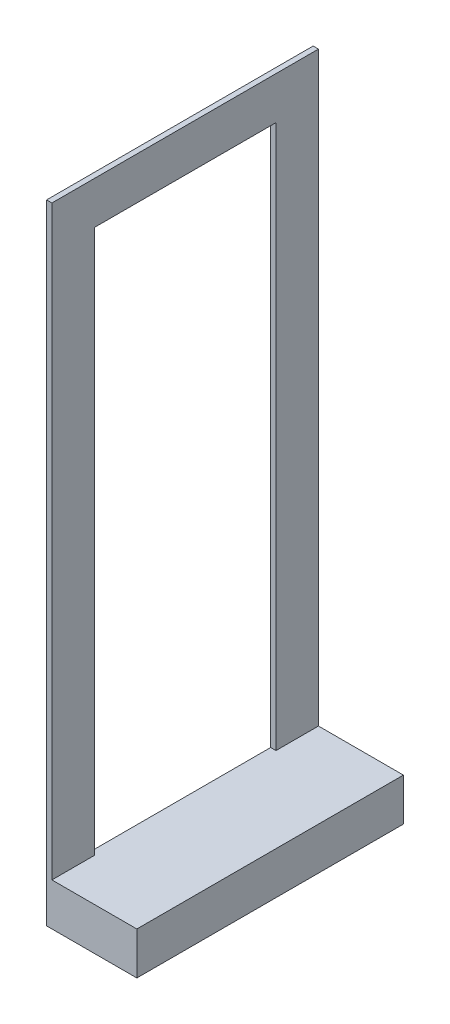
ISO-10303-21;
HEADER;
FILE_DESCRIPTION(('STEP AP214'),'2;1');
FILE_NAME('part.step','',(''),(''),'','','');
FILE_SCHEMA(('AUTOMOTIVE_DESIGN { 1 0 10303 214 1 1 1 1 }'));
ENDSEC;
DATA;
#1=APPLICATION_CONTEXT('core data for automotive mechanical design processes');
#2=APPLICATION_PROTOCOL_DEFINITION('international standard','automotive_design',2000,#1);
#3=PRODUCT_CONTEXT('',#1,'mechanical');
#4=PRODUCT('Part','Part','',(#3));
#5=PRODUCT_RELATED_PRODUCT_CATEGORY('part','',(#4));
#6=PRODUCT_DEFINITION_FORMATION('','',#4);
#7=PRODUCT_DEFINITION_CONTEXT('part definition',#1,'design');
#8=PRODUCT_DEFINITION('design','',#6,#7);
#9=PRODUCT_DEFINITION_SHAPE('','',#8);
#10=(LENGTH_UNIT() NAMED_UNIT(*) SI_UNIT(.MILLI.,.METRE.));
#11=(NAMED_UNIT(*) PLANE_ANGLE_UNIT() SI_UNIT($,.RADIAN.));
#12=(NAMED_UNIT(*) SI_UNIT($,.STERADIAN.) SOLID_ANGLE_UNIT());
#13=UNCERTAINTY_MEASURE_WITH_UNIT(LENGTH_MEASURE(1.E-05),#10,'distance_accuracy_value','');
#14=(GEOMETRIC_REPRESENTATION_CONTEXT(3) GLOBAL_UNCERTAINTY_ASSIGNED_CONTEXT((#13)) GLOBAL_UNIT_ASSIGNED_CONTEXT((#10,
#11,#12)) REPRESENTATION_CONTEXT('',''));
#15=CARTESIAN_POINT('',(0.,0.,0.));
#16=DIRECTION('',(0.,0.,1.));
#17=DIRECTION('',(1.,0.,0.));
#18=AXIS2_PLACEMENT_3D('',#15,#16,#17);
#19=CARTESIAN_POINT('',(180.9115,0.,0.));
#20=DIRECTION('',(1.,0.,0.));
#21=DIRECTION('',(0.,0.,-1.));
#22=AXIS2_PLACEMENT_3D('',#19,#20,#21);
#23=PLANE('',#22);
#24=DIRECTION('',(0.,0.,1.));
#25=VECTOR('',#24,1.);
#26=CARTESIAN_POINT('',(180.9115,12.7,0.));
#27=LINE('',#26,#25);
#28=CARTESIAN_POINT('',(180.9115,12.7,-79.7131009293537));
#29=VERTEX_POINT('',#28);
#30=CARTESIAN_POINT('',(180.9115,12.7,-67.0131009293537));
#31=VERTEX_POINT('',#30);
#32=EDGE_CURVE('E93',#29,#31,#27,.T.);
#33=ORIENTED_EDGE('',*,*,#32,.F.);
#34=DIRECTION('',(0.,1.,0.));
#35=VECTOR('',#34,1.);
#36=CARTESIAN_POINT('',(180.9115,0.,-79.7131009293537));
#37=LINE('',#36,#35);
#38=CARTESIAN_POINT('',(180.9115,188.030607332465,-79.7131009293537));
#39=VERTEX_POINT('',#38);
#40=EDGE_CURVE('E223',#29,#39,#37,.T.);
#41=ORIENTED_EDGE('',*,*,#40,.T.);
#42=DIRECTION('',(0.,0.,1.));
#43=VECTOR('',#42,1.);
#44=CARTESIAN_POINT('',(180.9115,188.030607332465,0.));
#45=LINE('',#44,#43);
#46=CARTESIAN_POINT('',(180.9115,188.030607332465,0.));
#47=VERTEX_POINT('',#46);
#48=EDGE_CURVE('E226',#39,#47,#45,.T.);
#49=ORIENTED_EDGE('',*,*,#48,.T.);
#50=DIRECTION('',(0.,-1.,0.));
#51=VECTOR('',#50,1.);
#52=CARTESIAN_POINT('',(180.9115,0.,0.));
#53=LINE('',#52,#51);
#54=CARTESIAN_POINT('',(180.9115,12.7,0.));
#55=VERTEX_POINT('',#54);
#56=EDGE_CURVE('E221',#47,#55,#53,.T.);
#57=ORIENTED_EDGE('',*,*,#56,.T.);
#58=CARTESIAN_POINT('',(180.9115,12.7,-12.7));
#59=VERTEX_POINT('',#58);
#60=EDGE_CURVE('E12',#59,#55,#27,.T.);
#61=ORIENTED_EDGE('',*,*,#60,.F.);
#62=DIRECTION('',(0.,-1.,0.));
#63=VECTOR('',#62,1.);
#64=CARTESIAN_POINT('',(180.9115,0.,-12.7));
#65=LINE('',#64,#63);
#66=CARTESIAN_POINT('',(180.9115,175.330607332465,-12.7));
#67=VERTEX_POINT('',#66);
#68=EDGE_CURVE('E194',#67,#59,#65,.T.);
#69=ORIENTED_EDGE('',*,*,#68,.F.);
#70=DIRECTION('',(0.,0.,1.));
#71=VECTOR('',#70,1.);
#72=CARTESIAN_POINT('',(180.9115,175.330607332465,0.));
#73=LINE('',#72,#71);
#74=CARTESIAN_POINT('',(180.9115,175.330607332465,-67.0131009293537));
#75=VERTEX_POINT('',#74);
#76=EDGE_CURVE('E200',#75,#67,#73,.T.);
#77=ORIENTED_EDGE('',*,*,#76,.F.);
#78=DIRECTION('',(0.,1.,0.));
#79=VECTOR('',#78,1.);
#80=CARTESIAN_POINT('',(180.9115,0.,-67.0131009293537));
#81=LINE('',#80,#79);
#82=EDGE_CURVE('E197',#31,#75,#81,.T.);
#83=ORIENTED_EDGE('',*,*,#82,.F.);
#84=EDGE_LOOP('',(#33,#41,#49,#57,#61,#69,#77,#83));
#85=FACE_BOUND('',#84,.T.);
#86=ADVANCED_FACE('F83',(#85),#23,.T.);
#87=CARTESIAN_POINT('',(179.324,0.,0.));
#88=DIRECTION('',(1.,0.,0.));
#89=DIRECTION('',(0.,0.,-1.));
#90=AXIS2_PLACEMENT_3D('',#87,#88,#89);
#91=PLANE('',#90);
#92=DIRECTION('',(0.,-1.,0.));
#93=VECTOR('',#92,1.);
#94=CARTESIAN_POINT('',(179.324,0.,0.));
#95=LINE('',#94,#93);
#96=CARTESIAN_POINT('',(179.324,188.030607332465,0.));
#97=VERTEX_POINT('',#96);
#98=CARTESIAN_POINT('',(179.324,0.,0.));
#99=VERTEX_POINT('',#98);
#100=EDGE_CURVE('E169',#97,#99,#95,.T.);
#101=ORIENTED_EDGE('',*,*,#100,.F.);
#102=DIRECTION('',(0.,0.,1.));
#103=VECTOR('',#102,1.);
#104=CARTESIAN_POINT('',(179.324,188.030607332465,0.));
#105=LINE('',#104,#103);
#106=CARTESIAN_POINT('',(179.324,188.030607332465,-79.7131009293537));
#107=VERTEX_POINT('',#106);
#108=EDGE_CURVE('E224',#107,#97,#105,.T.);
#109=ORIENTED_EDGE('',*,*,#108,.F.);
#110=DIRECTION('',(0.,1.,0.));
#111=VECTOR('',#110,1.);
#112=CARTESIAN_POINT('',(179.324,0.,-79.7131009293537));
#113=LINE('',#112,#111);
#114=CARTESIAN_POINT('',(179.324,0.,-79.7131009293537));
#115=VERTEX_POINT('',#114);
#116=EDGE_CURVE('E232',#115,#107,#113,.T.);
#117=ORIENTED_EDGE('',*,*,#116,.F.);
#118=DIRECTION('',(0.,0.,-1.));
#119=VECTOR('',#118,1.);
#120=CARTESIAN_POINT('',(179.324,0.,0.));
#121=LINE('',#120,#119);
#122=EDGE_CURVE('E230',#99,#115,#121,.T.);
#123=ORIENTED_EDGE('',*,*,#122,.F.);
#124=EDGE_LOOP('',(#101,#109,#117,#123));
#125=FACE_BOUND('',#124,.T.);
#126=DIRECTION('',(0.,-1.,0.));
#127=VECTOR('',#126,1.);
#128=CARTESIAN_POINT('',(179.324,0.,-12.7));
#129=LINE('',#128,#127);
#130=CARTESIAN_POINT('',(179.324,175.330607332465,-12.7));
#131=VERTEX_POINT('',#130);
#132=CARTESIAN_POINT('',(179.324,12.7,-12.7));
#133=VERTEX_POINT('',#132);
#134=EDGE_CURVE('E193',#131,#133,#129,.T.);
#135=ORIENTED_EDGE('',*,*,#134,.T.);
#136=DIRECTION('',(0.,0.,-1.));
#137=VECTOR('',#136,1.);
#138=CARTESIAN_POINT('',(179.324,12.7,0.));
#139=LINE('',#138,#137);
#140=CARTESIAN_POINT('',(179.324,12.7,-67.0131009293537));
#141=VERTEX_POINT('',#140);
#142=EDGE_CURVE('E205',#133,#141,#139,.T.);
#143=ORIENTED_EDGE('',*,*,#142,.T.);
#144=DIRECTION('',(0.,1.,0.));
#145=VECTOR('',#144,1.);
#146=CARTESIAN_POINT('',(179.324,0.,-67.0131009293537));
#147=LINE('',#146,#145);
#148=CARTESIAN_POINT('',(179.324,175.330607332465,-67.0131009293537));
#149=VERTEX_POINT('',#148);
#150=EDGE_CURVE('E208',#141,#149,#147,.T.);
#151=ORIENTED_EDGE('',*,*,#150,.T.);
#152=DIRECTION('',(0.,0.,1.));
#153=VECTOR('',#152,1.);
#154=CARTESIAN_POINT('',(179.324,175.330607332465,0.));
#155=LINE('',#154,#153);
#156=EDGE_CURVE('E198',#149,#131,#155,.T.);
#157=ORIENTED_EDGE('',*,*,#156,.T.);
#158=EDGE_LOOP('',(#135,#143,#151,#157));
#159=FACE_BOUND('',#158,.T.);
#160=ADVANCED_FACE('F245',(#125,#159),#91,.F.);
#161=CARTESIAN_POINT('',(180.9115,0.,0.));
#162=DIRECTION('',(0.,0.,-1.));
#163=DIRECTION('',(-1.,0.,0.));
#164=AXIS2_PLACEMENT_3D('',#161,#162,#163);
#165=PLANE('',#164);
#166=ORIENTED_EDGE('',*,*,#100,.T.);
#167=DIRECTION('',(-1.,0.,0.));
#168=VECTOR('',#167,1.);
#169=CARTESIAN_POINT('',(180.9115,0.,0.));
#170=LINE('',#169,#168);
#171=CARTESIAN_POINT('',(206.3115,0.,0.));
#172=VERTEX_POINT('',#171);
#173=EDGE_CURVE('E87',#172,#99,#170,.T.);
#174=ORIENTED_EDGE('',*,*,#173,.F.);
#175=DIRECTION('',(0.,-1.,0.));
#176=VECTOR('',#175,1.);
#177=CARTESIAN_POINT('',(206.3115,0.,0.));
#178=LINE('',#177,#176);
#179=CARTESIAN_POINT('',(206.3115,12.7,0.));
#180=VERTEX_POINT('',#179);
#181=EDGE_CURVE('E166',#180,#172,#178,.T.);
#182=ORIENTED_EDGE('',*,*,#181,.F.);
#183=DIRECTION('',(-1.,0.,0.));
#184=VECTOR('',#183,1.);
#185=CARTESIAN_POINT('',(206.3115,12.7,0.));
#186=LINE('',#185,#184);
#187=EDGE_CURVE('E187',#180,#55,#186,.T.);
#188=ORIENTED_EDGE('',*,*,#187,.T.);
#189=ORIENTED_EDGE('',*,*,#56,.F.);
#190=DIRECTION('',(-1.,0.,0.));
#191=VECTOR('',#190,1.);
#192=CARTESIAN_POINT('',(180.9115,188.030607332465,0.));
#193=LINE('',#192,#191);
#194=EDGE_CURVE('E228',#47,#97,#193,.T.);
#195=ORIENTED_EDGE('',*,*,#194,.T.);
#196=EDGE_LOOP('',(#166,#174,#182,#188,#189,#195));
#197=FACE_BOUND('',#196,.T.);
#198=ADVANCED_FACE('F85',(#197),#165,.F.);
#199=CARTESIAN_POINT('',(180.9115,0.,0.));
#200=DIRECTION('',(0.,1.,0.));
#201=DIRECTION('',(0.,0.,1.));
#202=AXIS2_PLACEMENT_3D('',#199,#200,#201);
#203=PLANE('',#202);
#204=ORIENTED_EDGE('',*,*,#122,.T.);
#205=DIRECTION('',(-1.,0.,0.));
#206=VECTOR('',#205,1.);
#207=CARTESIAN_POINT('',(180.9115,0.,-79.7131009293537));
#208=LINE('',#207,#206);
#209=CARTESIAN_POINT('',(206.3115,0.,-79.7131009293537));
#210=VERTEX_POINT('',#209);
#211=EDGE_CURVE('E171',#210,#115,#208,.T.);
#212=ORIENTED_EDGE('',*,*,#211,.F.);
#213=DIRECTION('',(0.,0.,-1.));
#214=VECTOR('',#213,1.);
#215=CARTESIAN_POINT('',(206.3115,0.,0.));
#216=LINE('',#215,#214);
#217=EDGE_CURVE('E173',#172,#210,#216,.T.);
#218=ORIENTED_EDGE('',*,*,#217,.F.);
#219=ORIENTED_EDGE('',*,*,#173,.T.);
#220=EDGE_LOOP('',(#204,#212,#218,#219));
#221=FACE_BOUND('',#220,.T.);
#222=ADVANCED_FACE('F174',(#221),#203,.F.);
#223=CARTESIAN_POINT('',(180.9115,0.,-79.7131009293537));
#224=DIRECTION('',(0.,0.,1.));
#225=DIRECTION('',(1.,0.,0.));
#226=AXIS2_PLACEMENT_3D('',#223,#224,#225);
#227=PLANE('',#226);
#228=ORIENTED_EDGE('',*,*,#116,.T.);
#229=DIRECTION('',(-1.,0.,0.));
#230=VECTOR('',#229,1.);
#231=CARTESIAN_POINT('',(180.9115,188.030607332465,-79.7131009293537));
#232=LINE('',#231,#230);
#233=EDGE_CURVE('E236',#39,#107,#232,.T.);
#234=ORIENTED_EDGE('',*,*,#233,.F.);
#235=ORIENTED_EDGE('',*,*,#40,.F.);
#236=DIRECTION('',(-1.,0.,0.));
#237=VECTOR('',#236,1.);
#238=CARTESIAN_POINT('',(206.3115,12.7,-79.7131009293537));
#239=LINE('',#238,#237);
#240=CARTESIAN_POINT('',(206.3115,12.7,-79.7131009293537));
#241=VERTEX_POINT('',#240);
#242=EDGE_CURVE('E190',#241,#29,#239,.T.);
#243=ORIENTED_EDGE('',*,*,#242,.F.);
#244=DIRECTION('',(0.,1.,0.));
#245=VECTOR('',#244,1.);
#246=CARTESIAN_POINT('',(206.3115,0.,-79.7131009293537));
#247=LINE('',#246,#245);
#248=EDGE_CURVE('E178',#210,#241,#247,.T.);
#249=ORIENTED_EDGE('',*,*,#248,.F.);
#250=ORIENTED_EDGE('',*,*,#211,.T.);
#251=EDGE_LOOP('',(#228,#234,#235,#243,#249,#250));
#252=FACE_BOUND('',#251,.T.);
#253=ADVANCED_FACE('F240',(#252),#227,.F.);
#254=CARTESIAN_POINT('',(180.9115,188.030607332465,0.));
#255=DIRECTION('',(0.,-1.,0.));
#256=DIRECTION('',(0.,0.,-1.));
#257=AXIS2_PLACEMENT_3D('',#254,#255,#256);
#258=PLANE('',#257);
#259=ORIENTED_EDGE('',*,*,#108,.T.);
#260=ORIENTED_EDGE('',*,*,#194,.F.);
#261=ORIENTED_EDGE('',*,*,#48,.F.);
#262=ORIENTED_EDGE('',*,*,#233,.T.);
#263=EDGE_LOOP('',(#259,#260,#261,#262));
#264=FACE_BOUND('',#263,.T.);
#265=ADVANCED_FACE('F249',(#264),#258,.F.);
#266=CARTESIAN_POINT('',(180.9115,0.,-12.7));
#267=DIRECTION('',(0.,0.,-1.));
#268=DIRECTION('',(-1.,0.,0.));
#269=AXIS2_PLACEMENT_3D('',#266,#267,#268);
#270=PLANE('',#269);
#271=ORIENTED_EDGE('',*,*,#134,.F.);
#272=DIRECTION('',(-1.,0.,0.));
#273=VECTOR('',#272,1.);
#274=CARTESIAN_POINT('',(180.9115,175.330607332465,-12.7));
#275=LINE('',#274,#273);
#276=EDGE_CURVE('E202',#67,#131,#275,.T.);
#277=ORIENTED_EDGE('',*,*,#276,.F.);
#278=ORIENTED_EDGE('',*,*,#68,.T.);
#279=DIRECTION('',(-1.,0.,0.));
#280=VECTOR('',#279,1.);
#281=CARTESIAN_POINT('',(180.9115,12.7,-12.7));
#282=LINE('',#281,#280);
#283=EDGE_CURVE('E218',#59,#133,#282,.T.);
#284=ORIENTED_EDGE('',*,*,#283,.T.);
#285=EDGE_LOOP('',(#271,#277,#278,#284));
#286=FACE_BOUND('',#285,.T.);
#287=ADVANCED_FACE('F257',(#286),#270,.T.);
#288=CARTESIAN_POINT('',(180.9115,12.7,0.));
#289=DIRECTION('',(0.,1.,0.));
#290=DIRECTION('',(0.,0.,1.));
#291=AXIS2_PLACEMENT_3D('',#288,#289,#290);
#292=PLANE('',#291);
#293=ORIENTED_EDGE('',*,*,#142,.F.);
#294=ORIENTED_EDGE('',*,*,#283,.F.);
#295=ORIENTED_EDGE('',*,*,#60,.T.);
#296=ORIENTED_EDGE('',*,*,#187,.F.);
#297=DIRECTION('',(0.,0.,1.));
#298=VECTOR('',#297,1.);
#299=CARTESIAN_POINT('',(206.3115,12.7,0.));
#300=LINE('',#299,#298);
#301=EDGE_CURVE('E182',#241,#180,#300,.T.);
#302=ORIENTED_EDGE('',*,*,#301,.F.);
#303=ORIENTED_EDGE('',*,*,#242,.T.);
#304=ORIENTED_EDGE('',*,*,#32,.T.);
#305=DIRECTION('',(-1.,0.,0.));
#306=VECTOR('',#305,1.);
#307=CARTESIAN_POINT('',(180.9115,12.7,-67.0131009293537));
#308=LINE('',#307,#306);
#309=EDGE_CURVE('E216',#31,#141,#308,.T.);
#310=ORIENTED_EDGE('',*,*,#309,.T.);
#311=EDGE_LOOP('',(#293,#294,#295,#296,#302,#303,#304,#310));
#312=FACE_BOUND('',#311,.T.);
#313=ADVANCED_FACE('F255',(#312),#292,.T.);
#314=CARTESIAN_POINT('',(180.9115,0.,-67.0131009293537));
#315=DIRECTION('',(0.,0.,1.));
#316=DIRECTION('',(1.,0.,0.));
#317=AXIS2_PLACEMENT_3D('',#314,#315,#316);
#318=PLANE('',#317);
#319=ORIENTED_EDGE('',*,*,#150,.F.);
#320=ORIENTED_EDGE('',*,*,#309,.F.);
#321=ORIENTED_EDGE('',*,*,#82,.T.);
#322=DIRECTION('',(-1.,0.,0.));
#323=VECTOR('',#322,1.);
#324=CARTESIAN_POINT('',(180.9115,175.330607332465,-67.0131009293537));
#325=LINE('',#324,#323);
#326=EDGE_CURVE('E107',#75,#149,#325,.T.);
#327=ORIENTED_EDGE('',*,*,#326,.T.);
#328=EDGE_LOOP('',(#319,#320,#321,#327));
#329=FACE_BOUND('',#328,.T.);
#330=ADVANCED_FACE('F263',(#329),#318,.T.);
#331=CARTESIAN_POINT('',(180.9115,175.330607332465,0.));
#332=DIRECTION('',(0.,-1.,0.));
#333=DIRECTION('',(0.,0.,-1.));
#334=AXIS2_PLACEMENT_3D('',#331,#332,#333);
#335=PLANE('',#334);
#336=ORIENTED_EDGE('',*,*,#156,.F.);
#337=ORIENTED_EDGE('',*,*,#326,.F.);
#338=ORIENTED_EDGE('',*,*,#76,.T.);
#339=ORIENTED_EDGE('',*,*,#276,.T.);
#340=EDGE_LOOP('',(#336,#337,#338,#339));
#341=FACE_BOUND('',#340,.T.);
#342=ADVANCED_FACE('F260',(#341),#335,.T.);
#343=CARTESIAN_POINT('',(206.3115,0.,0.));
#344=DIRECTION('',(-1.,0.,0.));
#345=DIRECTION('',(0.,0.,1.));
#346=AXIS2_PLACEMENT_3D('',#343,#344,#345);
#347=PLANE('',#346);
#348=ORIENTED_EDGE('',*,*,#181,.T.);
#349=ORIENTED_EDGE('',*,*,#217,.T.);
#350=ORIENTED_EDGE('',*,*,#248,.T.);
#351=ORIENTED_EDGE('',*,*,#301,.T.);
#352=EDGE_LOOP('',(#348,#349,#350,#351));
#353=FACE_BOUND('',#352,.T.);
#354=ADVANCED_FACE('F180',(#353),#347,.F.);
#355=CLOSED_SHELL('',(#86,#160,#198,#222,#253,#265,#287,#313,#330,#342,#354));
#356=MANIFOLD_SOLID_BREP('B2',#355);
#357=ADVANCED_BREP_SHAPE_REPRESENTATION('',(#18,#356),#14);
#358=SHAPE_DEFINITION_REPRESENTATION(#9,#357);
ENDSEC;
END-ISO-10303-21;
